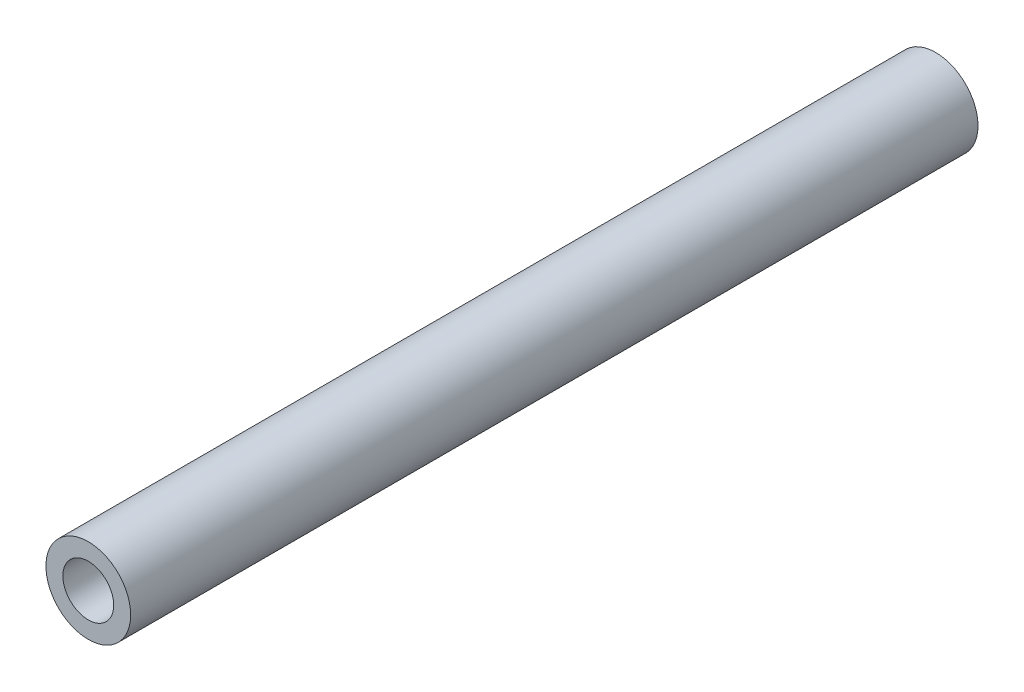
ISO-10303-21;
HEADER;
FILE_DESCRIPTION(('STEP AP214'),'2;1');
FILE_NAME('part.step','',(''),(''),'','','');
FILE_SCHEMA(('AUTOMOTIVE_DESIGN { 1 0 10303 214 1 1 1 1 }'));
ENDSEC;
DATA;
#1=APPLICATION_CONTEXT('core data for automotive mechanical design processes');
#2=APPLICATION_PROTOCOL_DEFINITION('international standard','automotive_design',2000,#1);
#3=PRODUCT_CONTEXT('',#1,'mechanical');
#4=PRODUCT('Part','Part','',(#3));
#5=PRODUCT_RELATED_PRODUCT_CATEGORY('part','',(#4));
#6=PRODUCT_DEFINITION_FORMATION('','',#4);
#7=PRODUCT_DEFINITION_CONTEXT('part definition',#1,'design');
#8=PRODUCT_DEFINITION('design','',#6,#7);
#9=PRODUCT_DEFINITION_SHAPE('','',#8);
#10=(LENGTH_UNIT() NAMED_UNIT(*) SI_UNIT(.MILLI.,.METRE.));
#11=(NAMED_UNIT(*) PLANE_ANGLE_UNIT() SI_UNIT($,.RADIAN.));
#12=(NAMED_UNIT(*) SI_UNIT($,.STERADIAN.) SOLID_ANGLE_UNIT());
#13=UNCERTAINTY_MEASURE_WITH_UNIT(LENGTH_MEASURE(1.E-05),#10,'distance_accuracy_value','');
#14=(GEOMETRIC_REPRESENTATION_CONTEXT(3) GLOBAL_UNCERTAINTY_ASSIGNED_CONTEXT((#13)) GLOBAL_UNIT_ASSIGNED_CONTEXT((#10,
#11,#12)) REPRESENTATION_CONTEXT('',''));
#15=CARTESIAN_POINT('',(0.,0.,0.));
#16=DIRECTION('',(0.,0.,1.));
#17=DIRECTION('',(1.,0.,0.));
#18=AXIS2_PLACEMENT_3D('',#15,#16,#17);
#19=CARTESIAN_POINT('',(0.,0.,40.));
#20=DIRECTION('',(0.,0.,1.));
#21=DIRECTION('',(1.,0.,0.));
#22=AXIS2_PLACEMENT_3D('',#19,#20,#21);
#23=PLANE('',#22);
#24=CARTESIAN_POINT('',(0.,0.,40.));
#25=DIRECTION('',(0.,0.,1.));
#26=DIRECTION('',(1.,0.,0.));
#27=AXIS2_PLACEMENT_3D('',#24,#25,#26);
#28=CIRCLE('',#27,1.5);
#29=CARTESIAN_POINT('',(1.5,0.,40.));
#30=VERTEX_POINT('',#29);
#31=EDGE_CURVE('E46',#30,#30,#28,.T.);
#32=ORIENTED_EDGE('',*,*,#31,.T.);
#33=EDGE_LOOP('',(#32));
#34=FACE_BOUND('',#33,.T.);
#35=ADVANCED_FACE('F15',(#34),#23,.T.);
#36=CARTESIAN_POINT('',(0.,0.,10.));
#37=DIRECTION('',(0.,0.,-1.));
#38=DIRECTION('',(-1.,0.,0.));
#39=AXIS2_PLACEMENT_3D('',#36,#37,#38);
#40=PLANE('',#39);
#41=CARTESIAN_POINT('',(0.,0.,10.));
#42=DIRECTION('',(0.,0.,-1.));
#43=DIRECTION('',(-1.,0.,0.));
#44=AXIS2_PLACEMENT_3D('',#41,#42,#43);
#45=CIRCLE('',#44,1.5);
#46=CARTESIAN_POINT('',(-1.5,0.,10.));
#47=VERTEX_POINT('',#46);
#48=EDGE_CURVE('E41',#47,#47,#45,.T.);
#49=ORIENTED_EDGE('',*,*,#48,.T.);
#50=EDGE_LOOP('',(#49));
#51=FACE_BOUND('',#50,.T.);
#52=ADVANCED_FACE('F56',(#51),#40,.T.);
#53=CARTESIAN_POINT('',(0.,0.,40.));
#54=DIRECTION('',(0.,0.,1.));
#55=DIRECTION('',(1.,0.,0.));
#56=AXIS2_PLACEMENT_3D('',#53,#54,#55);
#57=CYLINDRICAL_SURFACE('',#56,1.5);
#58=ORIENTED_EDGE('',*,*,#31,.F.);
#59=EDGE_LOOP('',(#58));
#60=FACE_BOUND('',#59,.T.);
#61=CARTESIAN_POINT('',(0.,0.,50.));
#62=DIRECTION('',(0.,0.,1.));
#63=DIRECTION('',(1.,0.,0.));
#64=AXIS2_PLACEMENT_3D('',#61,#62,#63);
#65=CIRCLE('',#64,1.5);
#66=CARTESIAN_POINT('',(1.5,0.,50.));
#67=VERTEX_POINT('',#66);
#68=EDGE_CURVE('E36',#67,#67,#65,.F.);
#69=ORIENTED_EDGE('',*,*,#68,.F.);
#70=EDGE_LOOP('',(#69));
#71=FACE_BOUND('',#70,.T.);
#72=ADVANCED_FACE('F52',(#60,#71),#57,.F.);
#73=CARTESIAN_POINT('',(0.,0.,10.));
#74=DIRECTION('',(0.,0.,-1.));
#75=DIRECTION('',(-1.,0.,0.));
#76=AXIS2_PLACEMENT_3D('',#73,#74,#75);
#77=CYLINDRICAL_SURFACE('',#76,1.5);
#78=CARTESIAN_POINT('',(0.,0.,0.));
#79=DIRECTION('',(0.,0.,-1.));
#80=DIRECTION('',(-1.,0.,0.));
#81=AXIS2_PLACEMENT_3D('',#78,#79,#80);
#82=CIRCLE('',#81,1.5);
#83=CARTESIAN_POINT('',(-1.5,0.,0.));
#84=VERTEX_POINT('',#83);
#85=EDGE_CURVE('E27',#84,#84,#82,.T.);
#86=ORIENTED_EDGE('',*,*,#85,.T.);
#87=EDGE_LOOP('',(#86));
#88=FACE_BOUND('',#87,.T.);
#89=ORIENTED_EDGE('',*,*,#48,.F.);
#90=EDGE_LOOP('',(#89));
#91=FACE_BOUND('',#90,.T.);
#92=ADVANCED_FACE('F55',(#88,#91),#77,.F.);
#93=CARTESIAN_POINT('',(0.,0.,50.));
#94=DIRECTION('',(0.,0.,1.));
#95=DIRECTION('',(1.,0.,0.));
#96=AXIS2_PLACEMENT_3D('',#93,#94,#95);
#97=PLANE('',#96);
#98=ORIENTED_EDGE('',*,*,#68,.T.);
#99=EDGE_LOOP('',(#98));
#100=FACE_BOUND('',#99,.T.);
#101=CARTESIAN_POINT('',(0.,0.,50.));
#102=DIRECTION('',(0.,0.,1.));
#103=DIRECTION('',(1.,0.,0.));
#104=AXIS2_PLACEMENT_3D('',#101,#102,#103);
#105=CIRCLE('',#104,2.5);
#106=CARTESIAN_POINT('',(2.5,0.,50.));
#107=VERTEX_POINT('',#106);
#108=EDGE_CURVE('E22',#107,#107,#105,.F.);
#109=ORIENTED_EDGE('',*,*,#108,.F.);
#110=EDGE_LOOP('',(#109));
#111=FACE_BOUND('',#110,.T.);
#112=ADVANCED_FACE('F60',(#100,#111),#97,.T.);
#113=CARTESIAN_POINT('',(0.,0.,0.));
#114=DIRECTION('',(0.,0.,1.));
#115=DIRECTION('',(1.,0.,0.));
#116=AXIS2_PLACEMENT_3D('',#113,#114,#115);
#117=PLANE('',#116);
#118=ORIENTED_EDGE('',*,*,#85,.F.);
#119=EDGE_LOOP('',(#118));
#120=FACE_BOUND('',#119,.T.);
#121=CARTESIAN_POINT('',(0.,0.,0.));
#122=DIRECTION('',(0.,0.,1.));
#123=DIRECTION('',(1.,0.,0.));
#124=AXIS2_PLACEMENT_3D('',#121,#122,#123);
#125=CIRCLE('',#124,2.5);
#126=CARTESIAN_POINT('',(2.5,0.,0.));
#127=VERTEX_POINT('',#126);
#128=EDGE_CURVE('E10',#127,#127,#125,.T.);
#129=ORIENTED_EDGE('',*,*,#128,.F.);
#130=EDGE_LOOP('',(#129));
#131=FACE_BOUND('',#130,.T.);
#132=ADVANCED_FACE('F63',(#120,#131),#117,.F.);
#133=CARTESIAN_POINT('',(0.,0.,0.));
#134=DIRECTION('',(0.,0.,1.));
#135=DIRECTION('',(1.,0.,0.));
#136=AXIS2_PLACEMENT_3D('',#133,#134,#135);
#137=CYLINDRICAL_SURFACE('',#136,2.5);
#138=ORIENTED_EDGE('',*,*,#128,.T.);
#139=EDGE_LOOP('',(#138));
#140=FACE_BOUND('',#139,.T.);
#141=ORIENTED_EDGE('',*,*,#108,.T.);
#142=EDGE_LOOP('',(#141));
#143=FACE_BOUND('',#142,.T.);
#144=ADVANCED_FACE('F67',(#140,#143),#137,.T.);
#145=CLOSED_SHELL('',(#35,#52,#72,#92,#112,#132,#144));
#146=MANIFOLD_SOLID_BREP('B1',#145);
#147=ADVANCED_BREP_SHAPE_REPRESENTATION('',(#18,#146),#14);
#148=SHAPE_DEFINITION_REPRESENTATION(#9,#147);
ENDSEC;
END-ISO-10303-21;
